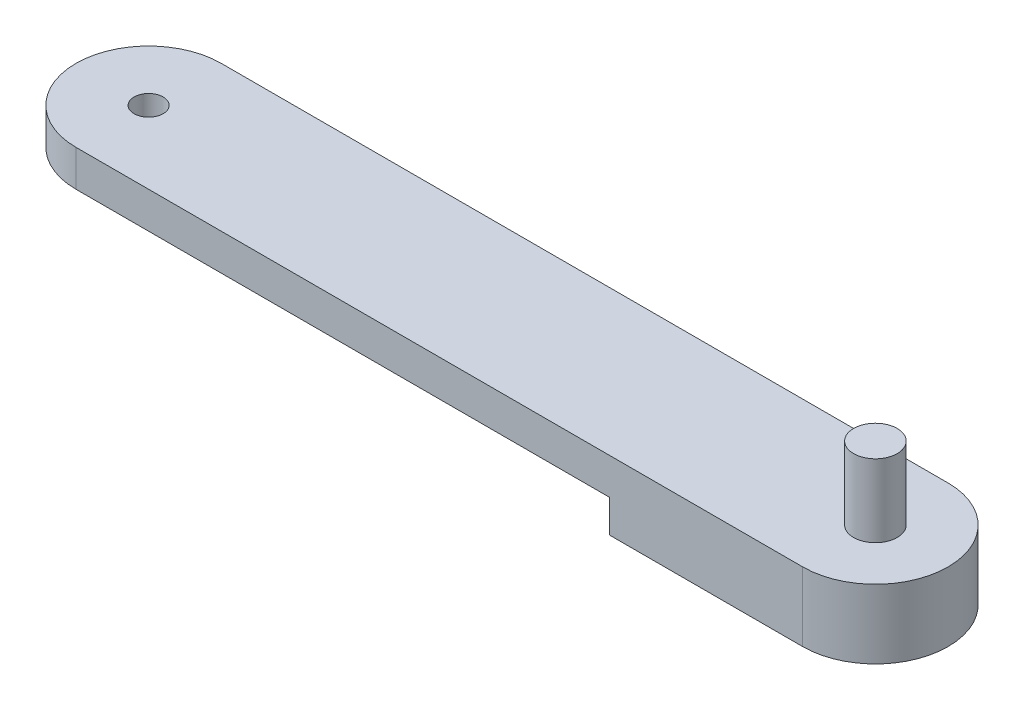
ISO-10303-21;
HEADER;
FILE_DESCRIPTION(('STEP AP214'),'2;1');
FILE_NAME('part.step','',(''),(''),'','','');
FILE_SCHEMA(('AUTOMOTIVE_DESIGN { 1 0 10303 214 1 1 1 1 }'));
ENDSEC;
DATA;
#1=APPLICATION_CONTEXT('core data for automotive mechanical design processes');
#2=APPLICATION_PROTOCOL_DEFINITION('international standard','automotive_design',2000,#1);
#3=PRODUCT_CONTEXT('',#1,'mechanical');
#4=PRODUCT('Part','Part','',(#3));
#5=PRODUCT_RELATED_PRODUCT_CATEGORY('part','',(#4));
#6=PRODUCT_DEFINITION_FORMATION('','',#4);
#7=PRODUCT_DEFINITION_CONTEXT('part definition',#1,'design');
#8=PRODUCT_DEFINITION('design','',#6,#7);
#9=PRODUCT_DEFINITION_SHAPE('','',#8);
#10=(LENGTH_UNIT() NAMED_UNIT(*) SI_UNIT(.MILLI.,.METRE.));
#11=(NAMED_UNIT(*) PLANE_ANGLE_UNIT() SI_UNIT($,.RADIAN.));
#12=(NAMED_UNIT(*) SI_UNIT($,.STERADIAN.) SOLID_ANGLE_UNIT());
#13=UNCERTAINTY_MEASURE_WITH_UNIT(LENGTH_MEASURE(1.E-05),#10,'distance_accuracy_value','');
#14=(GEOMETRIC_REPRESENTATION_CONTEXT(3) GLOBAL_UNCERTAINTY_ASSIGNED_CONTEXT((#13)) GLOBAL_UNIT_ASSIGNED_CONTEXT((#10,
#11,#12)) REPRESENTATION_CONTEXT('',''));
#15=CARTESIAN_POINT('',(0.,0.,0.));
#16=DIRECTION('',(0.,0.,1.));
#17=DIRECTION('',(1.,0.,0.));
#18=AXIS2_PLACEMENT_3D('',#15,#16,#17);
#19=CARTESIAN_POINT('',(0.,0.,0.));
#20=DIRECTION('',(0.,1.,0.));
#21=DIRECTION('',(0.,0.,1.));
#22=AXIS2_PLACEMENT_3D('',#19,#20,#21);
#23=PLANE('',#22);
#24=CARTESIAN_POINT('',(0.,0.,0.));
#25=DIRECTION('',(0.,1.,0.));
#26=DIRECTION('',(0.,0.,1.));
#27=AXIS2_PLACEMENT_3D('',#24,#25,#26);
#28=CIRCLE('',#27,2.);
#29=CARTESIAN_POINT('',(0.,0.,2.));
#30=VERTEX_POINT('',#29);
#31=EDGE_CURVE('E200',#30,#30,#28,.T.);
#32=ORIENTED_EDGE('',*,*,#31,.T.);
#33=EDGE_LOOP('',(#32));
#34=FACE_BOUND('',#33,.T.);
#35=DIRECTION('',(0.,0.,-1.));
#36=VECTOR('',#35,1.);
#37=CARTESIAN_POINT('',(73.407763219862,0.,10.));
#38=LINE('',#37,#36);
#39=CARTESIAN_POINT('',(73.407763219862,0.,10.));
#40=VERTEX_POINT('',#39);
#41=CARTESIAN_POINT('',(73.407763219862,0.,-10.));
#42=VERTEX_POINT('',#41);
#43=EDGE_CURVE('E67',#40,#42,#38,.T.);
#44=ORIENTED_EDGE('',*,*,#43,.F.);
#45=DIRECTION('',(1.,0.,0.));
#46=VECTOR('',#45,1.);
#47=CARTESIAN_POINT('',(0.,0.,10.));
#48=LINE('',#47,#46);
#49=CARTESIAN_POINT('',(0.,0.,10.));
#50=VERTEX_POINT('',#49);
#51=EDGE_CURVE('E230',#50,#40,#48,.T.);
#52=ORIENTED_EDGE('',*,*,#51,.F.);
#53=CARTESIAN_POINT('',(0.,0.,0.));
#54=DIRECTION('',(0.,1.,0.));
#55=DIRECTION('',(0.,0.,1.));
#56=AXIS2_PLACEMENT_3D('',#53,#54,#55);
#57=CIRCLE('',#56,10.);
#58=CARTESIAN_POINT('',(0.,0.,-10.));
#59=VERTEX_POINT('',#58);
#60=EDGE_CURVE('E208',#59,#50,#57,.T.);
#61=ORIENTED_EDGE('',*,*,#60,.F.);
#62=DIRECTION('',(-1.,0.,0.));
#63=VECTOR('',#62,1.);
#64=CARTESIAN_POINT('',(0.,0.,-10.));
#65=LINE('',#64,#63);
#66=EDGE_CURVE('E217',#42,#59,#65,.T.);
#67=ORIENTED_EDGE('',*,*,#66,.F.);
#68=EDGE_LOOP('',(#44,#52,#61,#67));
#69=FACE_BOUND('',#68,.T.);
#70=ADVANCED_FACE('F43',(#34,#69),#23,.F.);
#71=CARTESIAN_POINT('',(0.,5.,0.));
#72=DIRECTION('',(0.,1.,0.));
#73=DIRECTION('',(0.,0.,1.));
#74=AXIS2_PLACEMENT_3D('',#71,#72,#73);
#75=PLANE('',#74);
#76=CARTESIAN_POINT('',(100.,5.,0.));
#77=DIRECTION('',(0.,1.,0.));
#78=DIRECTION('',(0.,0.,1.));
#79=AXIS2_PLACEMENT_3D('',#76,#77,#78);
#80=CIRCLE('',#79,3.00000000000001);
#81=CARTESIAN_POINT('',(100.,5.,3.00000000000001));
#82=VERTEX_POINT('',#81);
#83=EDGE_CURVE('E195',#82,#82,#80,.T.);
#84=ORIENTED_EDGE('',*,*,#83,.F.);
#85=EDGE_LOOP('',(#84));
#86=FACE_BOUND('',#85,.T.);
#87=CARTESIAN_POINT('',(0.,5.,0.));
#88=DIRECTION('',(0.,1.,0.));
#89=DIRECTION('',(0.,0.,1.));
#90=AXIS2_PLACEMENT_3D('',#87,#88,#89);
#91=CIRCLE('',#90,10.);
#92=CARTESIAN_POINT('',(0.,5.,-10.));
#93=VERTEX_POINT('',#92);
#94=CARTESIAN_POINT('',(0.,5.,10.));
#95=VERTEX_POINT('',#94);
#96=EDGE_CURVE('E212',#93,#95,#91,.T.);
#97=ORIENTED_EDGE('',*,*,#96,.T.);
#98=DIRECTION('',(1.,0.,0.));
#99=VECTOR('',#98,1.);
#100=CARTESIAN_POINT('',(0.,5.,10.));
#101=LINE('',#100,#99);
#102=CARTESIAN_POINT('',(100.,5.,10.));
#103=VERTEX_POINT('',#102);
#104=EDGE_CURVE('E216',#95,#103,#101,.T.);
#105=ORIENTED_EDGE('',*,*,#104,.T.);
#106=CARTESIAN_POINT('',(100.,5.,0.));
#107=DIRECTION('',(0.,1.,0.));
#108=DIRECTION('',(0.,0.,1.));
#109=AXIS2_PLACEMENT_3D('',#106,#107,#108);
#110=CIRCLE('',#109,10.);
#111=CARTESIAN_POINT('',(100.,5.,-10.));
#112=VERTEX_POINT('',#111);
#113=EDGE_CURVE('E220',#103,#112,#110,.T.);
#114=ORIENTED_EDGE('',*,*,#113,.T.);
#115=DIRECTION('',(-1.,0.,0.));
#116=VECTOR('',#115,1.);
#117=CARTESIAN_POINT('',(0.,5.,-10.));
#118=LINE('',#117,#116);
#119=EDGE_CURVE('E223',#112,#93,#118,.T.);
#120=ORIENTED_EDGE('',*,*,#119,.T.);
#121=EDGE_LOOP('',(#97,#105,#114,#120));
#122=FACE_BOUND('',#121,.T.);
#123=CARTESIAN_POINT('',(0.,5.,0.));
#124=DIRECTION('',(0.,1.,0.));
#125=DIRECTION('',(0.,0.,1.));
#126=AXIS2_PLACEMENT_3D('',#123,#124,#125);
#127=CIRCLE('',#126,2.);
#128=CARTESIAN_POINT('',(0.,5.,2.));
#129=VERTEX_POINT('',#128);
#130=EDGE_CURVE('E204',#129,#129,#127,.T.);
#131=ORIENTED_EDGE('',*,*,#130,.F.);
#132=EDGE_LOOP('',(#131));
#133=FACE_BOUND('',#132,.T.);
#134=ADVANCED_FACE('F262',(#86,#122,#133),#75,.T.);
#135=CARTESIAN_POINT('',(0.,5.,0.));
#136=DIRECTION('',(0.,-1.,0.));
#137=DIRECTION('',(0.,0.,-1.));
#138=AXIS2_PLACEMENT_3D('',#135,#136,#137);
#139=CYLINDRICAL_SURFACE('',#138,10.);
#140=ORIENTED_EDGE('',*,*,#60,.T.);
#141=DIRECTION('',(0.,-1.,0.));
#142=VECTOR('',#141,1.);
#143=CARTESIAN_POINT('',(0.,5.,10.));
#144=LINE('',#143,#142);
#145=EDGE_CURVE('E11',#95,#50,#144,.T.);
#146=ORIENTED_EDGE('',*,*,#145,.F.);
#147=ORIENTED_EDGE('',*,*,#96,.F.);
#148=DIRECTION('',(0.,-1.,0.));
#149=VECTOR('',#148,1.);
#150=CARTESIAN_POINT('',(0.,5.,-10.));
#151=LINE('',#150,#149);
#152=EDGE_CURVE('E226',#93,#59,#151,.T.);
#153=ORIENTED_EDGE('',*,*,#152,.T.);
#154=EDGE_LOOP('',(#140,#146,#147,#153));
#155=FACE_BOUND('',#154,.T.);
#156=ADVANCED_FACE('F45',(#155),#139,.T.);
#157=CARTESIAN_POINT('',(0.,5.,10.));
#158=DIRECTION('',(0.,0.,-1.));
#159=DIRECTION('',(-1.,0.,0.));
#160=AXIS2_PLACEMENT_3D('',#157,#158,#159);
#161=PLANE('',#160);
#162=ORIENTED_EDGE('',*,*,#51,.T.);
#163=DIRECTION('',(0.,1.,0.));
#164=VECTOR('',#163,1.);
#165=CARTESIAN_POINT('',(73.407763219862,-4.5,10.));
#166=LINE('',#165,#164);
#167=CARTESIAN_POINT('',(73.407763219862,-4.5,10.));
#168=VERTEX_POINT('',#167);
#169=EDGE_CURVE('E191',#168,#40,#166,.T.);
#170=ORIENTED_EDGE('',*,*,#169,.F.);
#171=DIRECTION('',(-1.,0.,0.));
#172=VECTOR('',#171,1.);
#173=CARTESIAN_POINT('',(100.,-4.5,10.));
#174=LINE('',#173,#172);
#175=CARTESIAN_POINT('',(100.,-4.5,10.));
#176=VERTEX_POINT('',#175);
#177=EDGE_CURVE('E175',#176,#168,#174,.T.);
#178=ORIENTED_EDGE('',*,*,#177,.F.);
#179=DIRECTION('',(0.,-1.,0.));
#180=VECTOR('',#179,1.);
#181=CARTESIAN_POINT('',(100.,5.,10.));
#182=LINE('',#181,#180);
#183=EDGE_CURVE('E52',#103,#176,#182,.T.);
#184=ORIENTED_EDGE('',*,*,#183,.F.);
#185=ORIENTED_EDGE('',*,*,#104,.F.);
#186=ORIENTED_EDGE('',*,*,#145,.T.);
#187=EDGE_LOOP('',(#162,#170,#178,#184,#185,#186));
#188=FACE_BOUND('',#187,.T.);
#189=ADVANCED_FACE('F250',(#188),#161,.F.);
#190=CARTESIAN_POINT('',(100.,5.,0.));
#191=DIRECTION('',(0.,-1.,0.));
#192=DIRECTION('',(0.,0.,-1.));
#193=AXIS2_PLACEMENT_3D('',#190,#191,#192);
#194=CYLINDRICAL_SURFACE('',#193,10.);
#195=ORIENTED_EDGE('',*,*,#183,.T.);
#196=CARTESIAN_POINT('',(100.,-4.5,0.));
#197=DIRECTION('',(0.,-1.,0.));
#198=DIRECTION('',(0.,0.,-1.));
#199=AXIS2_PLACEMENT_3D('',#196,#197,#198);
#200=CIRCLE('',#199,10.);
#201=CARTESIAN_POINT('',(100.,-4.5,-10.));
#202=VERTEX_POINT('',#201);
#203=EDGE_CURVE('E171',#202,#176,#200,.T.);
#204=ORIENTED_EDGE('',*,*,#203,.F.);
#205=DIRECTION('',(0.,-1.,0.));
#206=VECTOR('',#205,1.);
#207=CARTESIAN_POINT('',(100.,5.,-10.));
#208=LINE('',#207,#206);
#209=EDGE_CURVE('E238',#112,#202,#208,.T.);
#210=ORIENTED_EDGE('',*,*,#209,.F.);
#211=ORIENTED_EDGE('',*,*,#113,.F.);
#212=EDGE_LOOP('',(#195,#204,#210,#211));
#213=FACE_BOUND('',#212,.T.);
#214=ADVANCED_FACE('F246',(#213),#194,.T.);
#215=CARTESIAN_POINT('',(0.,5.,-10.));
#216=DIRECTION('',(0.,0.,1.));
#217=DIRECTION('',(1.,0.,0.));
#218=AXIS2_PLACEMENT_3D('',#215,#216,#217);
#219=PLANE('',#218);
#220=ORIENTED_EDGE('',*,*,#209,.T.);
#221=DIRECTION('',(1.,0.,0.));
#222=VECTOR('',#221,1.);
#223=CARTESIAN_POINT('',(100.,-4.5,-10.));
#224=LINE('',#223,#222);
#225=CARTESIAN_POINT('',(73.407763219862,-4.5,-10.));
#226=VERTEX_POINT('',#225);
#227=EDGE_CURVE('E181',#226,#202,#224,.T.);
#228=ORIENTED_EDGE('',*,*,#227,.F.);
#229=DIRECTION('',(0.,1.,0.));
#230=VECTOR('',#229,1.);
#231=CARTESIAN_POINT('',(73.407763219862,-4.5,-10.));
#232=LINE('',#231,#230);
#233=EDGE_CURVE('E185',#226,#42,#232,.T.);
#234=ORIENTED_EDGE('',*,*,#233,.T.);
#235=ORIENTED_EDGE('',*,*,#66,.T.);
#236=ORIENTED_EDGE('',*,*,#152,.F.);
#237=ORIENTED_EDGE('',*,*,#119,.F.);
#238=EDGE_LOOP('',(#220,#228,#234,#235,#236,#237));
#239=FACE_BOUND('',#238,.T.);
#240=ADVANCED_FACE('F257',(#239),#219,.F.);
#241=CARTESIAN_POINT('',(0.,5.,0.));
#242=DIRECTION('',(0.,-1.,0.));
#243=DIRECTION('',(0.,0.,-1.));
#244=AXIS2_PLACEMENT_3D('',#241,#242,#243);
#245=CYLINDRICAL_SURFACE('',#244,2.);
#246=ORIENTED_EDGE('',*,*,#130,.T.);
#247=EDGE_LOOP('',(#246));
#248=FACE_BOUND('',#247,.T.);
#249=ORIENTED_EDGE('',*,*,#31,.F.);
#250=EDGE_LOOP('',(#249));
#251=FACE_BOUND('',#250,.T.);
#252=ADVANCED_FACE('F293',(#248,#251),#245,.F.);
#253=CARTESIAN_POINT('',(100.,15.,0.));
#254=DIRECTION('',(0.,-1.,0.));
#255=DIRECTION('',(0.,0.,-1.));
#256=AXIS2_PLACEMENT_3D('',#253,#254,#255);
#257=CYLINDRICAL_SURFACE('',#256,3.00000000000001);
#258=CARTESIAN_POINT('',(100.,15.,0.));
#259=DIRECTION('',(0.,1.,0.));
#260=DIRECTION('',(0.,0.,1.));
#261=AXIS2_PLACEMENT_3D('',#258,#259,#260);
#262=CIRCLE('',#261,3.00000000000001);
#263=CARTESIAN_POINT('',(100.,15.,3.00000000000001));
#264=VERTEX_POINT('',#263);
#265=EDGE_CURVE('E196',#264,#264,#262,.T.);
#266=ORIENTED_EDGE('',*,*,#265,.F.);
#267=EDGE_LOOP('',(#266));
#268=FACE_BOUND('',#267,.T.);
#269=ORIENTED_EDGE('',*,*,#83,.T.);
#270=EDGE_LOOP('',(#269));
#271=FACE_BOUND('',#270,.T.);
#272=ADVANCED_FACE('F278',(#268,#271),#257,.T.);
#273=CARTESIAN_POINT('',(100.,15.,0.));
#274=DIRECTION('',(0.,1.,0.));
#275=DIRECTION('',(0.,0.,1.));
#276=AXIS2_PLACEMENT_3D('',#273,#274,#275);
#277=PLANE('',#276);
#278=ORIENTED_EDGE('',*,*,#265,.T.);
#279=EDGE_LOOP('',(#278));
#280=FACE_BOUND('',#279,.T.);
#281=ADVANCED_FACE('F270',(#280),#277,.T.);
#282=CARTESIAN_POINT('',(73.407763219862,-4.5,10.));
#283=DIRECTION('',(1.,0.,0.));
#284=DIRECTION('',(0.,0.,-1.));
#285=AXIS2_PLACEMENT_3D('',#282,#283,#284);
#286=PLANE('',#285);
#287=ORIENTED_EDGE('',*,*,#43,.T.);
#288=ORIENTED_EDGE('',*,*,#233,.F.);
#289=DIRECTION('',(0.,0.,-1.));
#290=VECTOR('',#289,1.);
#291=CARTESIAN_POINT('',(73.407763219862,-4.5,10.));
#292=LINE('',#291,#290);
#293=EDGE_CURVE('E178',#168,#226,#292,.T.);
#294=ORIENTED_EDGE('',*,*,#293,.F.);
#295=ORIENTED_EDGE('',*,*,#169,.T.);
#296=EDGE_LOOP('',(#287,#288,#294,#295));
#297=FACE_BOUND('',#296,.T.);
#298=ADVANCED_FACE('F268',(#297),#286,.F.);
#299=CARTESIAN_POINT('',(100.,-4.5,0.));
#300=DIRECTION('',(0.,-1.,0.));
#301=DIRECTION('',(0.,0.,-1.));
#302=AXIS2_PLACEMENT_3D('',#299,#300,#301);
#303=PLANE('',#302);
#304=CARTESIAN_POINT('',(100.,-4.5,0.));
#305=DIRECTION('',(0.,-1.,0.));
#306=DIRECTION('',(0.,0.,-1.));
#307=AXIS2_PLACEMENT_3D('',#304,#305,#306);
#308=CIRCLE('',#307,3.25097780652157);
#309=CARTESIAN_POINT('',(99.690178504128,-4.5,-3.23618098059912));
#310=VERTEX_POINT('',#309);
#311=CARTESIAN_POINT('',(99.690178504128,-4.5,3.23618098059912));
#312=VERTEX_POINT('',#311);
#313=EDGE_CURVE('E59',#310,#312,#308,.T.);
#314=ORIENTED_EDGE('',*,*,#313,.F.);
#315=DIRECTION('',(0.998861476848983,0.,-0.0477048222622033));
#316=VECTOR('',#315,1.);
#317=CARTESIAN_POINT('',(79.849230427639,-4.5,-2.28859322850323));
#318=LINE('',#317,#316);
#319=CARTESIAN_POINT('',(79.849230427639,-4.5,-2.28859322850323));
#320=VERTEX_POINT('',#319);
#321=EDGE_CURVE('E144',#320,#310,#318,.T.);
#322=ORIENTED_EDGE('',*,*,#321,.F.);
#323=CARTESIAN_POINT('',(79.849230427639,-4.5,0.));
#324=DIRECTION('',(0.,-1.,0.));
#325=DIRECTION('',(0.,0.,-1.));
#326=AXIS2_PLACEMENT_3D('',#323,#324,#325);
#327=CIRCLE('',#326,2.28859322850326);
#328=CARTESIAN_POINT('',(79.849230427639,-4.5,2.28859322850326));
#329=VERTEX_POINT('',#328);
#330=EDGE_CURVE('E148',#329,#320,#327,.T.);
#331=ORIENTED_EDGE('',*,*,#330,.F.);
#332=DIRECTION('',(-0.998861476848983,0.,-0.0477048222621997));
#333=VECTOR('',#332,1.);
#334=CARTESIAN_POINT('',(79.849230427639,-4.5,2.2885932285033));
#335=LINE('',#334,#333);
#336=EDGE_CURVE('E157',#312,#329,#335,.T.);
#337=ORIENTED_EDGE('',*,*,#336,.F.);
#338=EDGE_LOOP('',(#314,#322,#331,#337));
#339=FACE_BOUND('',#338,.T.);
#340=ORIENTED_EDGE('',*,*,#203,.T.);
#341=ORIENTED_EDGE('',*,*,#177,.T.);
#342=ORIENTED_EDGE('',*,*,#293,.T.);
#343=ORIENTED_EDGE('',*,*,#227,.T.);
#344=EDGE_LOOP('',(#340,#341,#342,#343));
#345=FACE_BOUND('',#344,.T.);
#346=ADVANCED_FACE('F253',(#339,#345),#303,.T.);
#347=CARTESIAN_POINT('',(100.,0.,0.));
#348=DIRECTION('',(0.,-1.,0.));
#349=DIRECTION('',(0.,0.,-1.));
#350=AXIS2_PLACEMENT_3D('',#347,#348,#349);
#351=CYLINDRICAL_SURFACE('',#350,3.25097780652157);
#352=ORIENTED_EDGE('',*,*,#313,.T.);
#353=DIRECTION('',(0.,-1.,0.));
#354=VECTOR('',#353,1.);
#355=CARTESIAN_POINT('',(99.690178504128,0.,3.23618098059912));
#356=LINE('',#355,#354);
#357=CARTESIAN_POINT('',(99.690178504128,0.,3.23618098059912));
#358=VERTEX_POINT('',#357);
#359=EDGE_CURVE('E119',#358,#312,#356,.T.);
#360=ORIENTED_EDGE('',*,*,#359,.F.);
#361=CARTESIAN_POINT('',(100.,0.,0.));
#362=DIRECTION('',(0.,-1.,0.));
#363=DIRECTION('',(0.,0.,-1.));
#364=AXIS2_PLACEMENT_3D('',#361,#362,#363);
#365=CIRCLE('',#364,3.25097780652157);
#366=CARTESIAN_POINT('',(99.690178504128,0.,-3.23618098059912));
#367=VERTEX_POINT('',#366);
#368=EDGE_CURVE('E123',#367,#358,#365,.T.);
#369=ORIENTED_EDGE('',*,*,#368,.F.);
#370=DIRECTION('',(0.,-1.,0.));
#371=VECTOR('',#370,1.);
#372=CARTESIAN_POINT('',(99.690178504128,0.,-3.23618098059912));
#373=LINE('',#372,#371);
#374=EDGE_CURVE('E163',#367,#310,#373,.T.);
#375=ORIENTED_EDGE('',*,*,#374,.T.);
#376=EDGE_LOOP('',(#352,#360,#369,#375));
#377=FACE_BOUND('',#376,.T.);
#378=ADVANCED_FACE('F121',(#377),#351,.F.);
#379=CARTESIAN_POINT('',(79.849230427639,0.,-2.28859322850323));
#380=DIRECTION('',(-0.0477048222622033,0.,-0.998861476848983));
#381=DIRECTION('',(-0.998861476848983,0.,0.0477048222622033));
#382=AXIS2_PLACEMENT_3D('',#379,#380,#381);
#383=PLANE('',#382);
#384=ORIENTED_EDGE('',*,*,#321,.T.);
#385=ORIENTED_EDGE('',*,*,#374,.F.);
#386=DIRECTION('',(0.998861476848983,0.,-0.0477048222622033));
#387=VECTOR('',#386,1.);
#388=CARTESIAN_POINT('',(79.849230427639,0.,-2.28859322850323));
#389=LINE('',#388,#387);
#390=CARTESIAN_POINT('',(79.849230427639,0.,-2.28859322850323));
#391=VERTEX_POINT('',#390);
#392=EDGE_CURVE('E130',#391,#367,#389,.T.);
#393=ORIENTED_EDGE('',*,*,#392,.F.);
#394=DIRECTION('',(0.,-1.,0.));
#395=VECTOR('',#394,1.);
#396=CARTESIAN_POINT('',(79.849230427639,0.,-2.28859322850323));
#397=LINE('',#396,#395);
#398=EDGE_CURVE('E166',#391,#320,#397,.T.);
#399=ORIENTED_EDGE('',*,*,#398,.T.);
#400=EDGE_LOOP('',(#384,#385,#393,#399));
#401=FACE_BOUND('',#400,.T.);
#402=ADVANCED_FACE('F371',(#401),#383,.F.);
#403=CARTESIAN_POINT('',(79.849230427639,0.,0.));
#404=DIRECTION('',(0.,-1.,0.));
#405=DIRECTION('',(0.,0.,-1.));
#406=AXIS2_PLACEMENT_3D('',#403,#404,#405);
#407=CYLINDRICAL_SURFACE('',#406,2.28859322850326);
#408=ORIENTED_EDGE('',*,*,#330,.T.);
#409=ORIENTED_EDGE('',*,*,#398,.F.);
#410=CARTESIAN_POINT('',(79.849230427639,0.,0.));
#411=DIRECTION('',(0.,-1.,0.));
#412=DIRECTION('',(0.,0.,-1.));
#413=AXIS2_PLACEMENT_3D('',#410,#411,#412);
#414=CIRCLE('',#413,2.28859322850326);
#415=CARTESIAN_POINT('',(79.849230427639,0.,2.28859322850326));
#416=VERTEX_POINT('',#415);
#417=EDGE_CURVE('E139',#416,#391,#414,.T.);
#418=ORIENTED_EDGE('',*,*,#417,.F.);
#419=DIRECTION('',(0.,-1.,0.));
#420=VECTOR('',#419,1.);
#421=CARTESIAN_POINT('',(79.849230427639,0.,2.28859322850326));
#422=LINE('',#421,#420);
#423=EDGE_CURVE('E129',#416,#329,#422,.T.);
#424=ORIENTED_EDGE('',*,*,#423,.T.);
#425=EDGE_LOOP('',(#408,#409,#418,#424));
#426=FACE_BOUND('',#425,.T.);
#427=ADVANCED_FACE('F381',(#426),#407,.F.);
#428=CARTESIAN_POINT('',(79.849230427639,0.,2.2885932285033));
#429=DIRECTION('',(-0.0477048222621997,0.,0.998861476848983));
#430=DIRECTION('',(0.998861476848983,0.,0.0477048222621997));
#431=AXIS2_PLACEMENT_3D('',#428,#429,#430);
#432=PLANE('',#431);
#433=ORIENTED_EDGE('',*,*,#336,.T.);
#434=ORIENTED_EDGE('',*,*,#423,.F.);
#435=DIRECTION('',(-0.998861476848983,0.,-0.0477048222621997));
#436=VECTOR('',#435,1.);
#437=CARTESIAN_POINT('',(79.849230427639,0.,2.2885932285033));
#438=LINE('',#437,#436);
#439=EDGE_CURVE('E133',#358,#416,#438,.T.);
#440=ORIENTED_EDGE('',*,*,#439,.F.);
#441=ORIENTED_EDGE('',*,*,#359,.T.);
#442=EDGE_LOOP('',(#433,#434,#440,#441));
#443=FACE_BOUND('',#442,.T.);
#444=ADVANCED_FACE('F134',(#443),#432,.F.);
#445=CARTESIAN_POINT('',(100.,0.,0.));
#446=DIRECTION('',(0.,-1.,0.));
#447=DIRECTION('',(0.,0.,-1.));
#448=AXIS2_PLACEMENT_3D('',#445,#446,#447);
#449=PLANE('',#448);
#450=ORIENTED_EDGE('',*,*,#368,.T.);
#451=ORIENTED_EDGE('',*,*,#439,.T.);
#452=ORIENTED_EDGE('',*,*,#417,.T.);
#453=ORIENTED_EDGE('',*,*,#392,.T.);
#454=EDGE_LOOP('',(#450,#451,#452,#453));
#455=FACE_BOUND('',#454,.T.);
#456=ADVANCED_FACE('F141',(#455),#449,.T.);
#457=CLOSED_SHELL('',(#70,#134,#156,#189,#214,#240,#252,#272,#281,#298,#346,#378,#402,#427,#444,#456));
#458=MANIFOLD_SOLID_BREP('B2',#457);
#459=ADVANCED_BREP_SHAPE_REPRESENTATION('',(#18,#458),#14);
#460=SHAPE_DEFINITION_REPRESENTATION(#9,#459);
ENDSEC;
END-ISO-10303-21;
